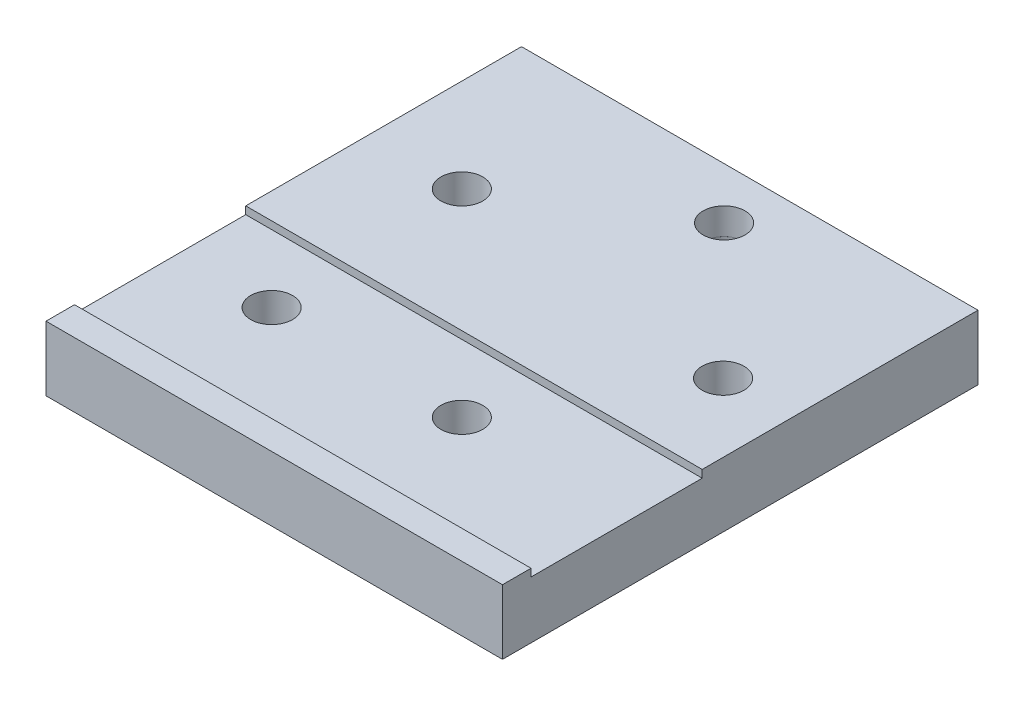
ISO-10303-21;
HEADER;
FILE_DESCRIPTION(('STEP AP214'),'2;1');
FILE_NAME('part.step','',(''),(''),'','','');
FILE_SCHEMA(('AUTOMOTIVE_DESIGN { 1 0 10303 214 1 1 1 1 }'));
ENDSEC;
DATA;
#1=APPLICATION_CONTEXT('core data for automotive mechanical design processes');
#2=APPLICATION_PROTOCOL_DEFINITION('international standard','automotive_design',2000,#1);
#3=PRODUCT_CONTEXT('',#1,'mechanical');
#4=PRODUCT('Part','Part','',(#3));
#5=PRODUCT_RELATED_PRODUCT_CATEGORY('part','',(#4));
#6=PRODUCT_DEFINITION_FORMATION('','',#4);
#7=PRODUCT_DEFINITION_CONTEXT('part definition',#1,'design');
#8=PRODUCT_DEFINITION('design','',#6,#7);
#9=PRODUCT_DEFINITION_SHAPE('','',#8);
#10=(LENGTH_UNIT() NAMED_UNIT(*) SI_UNIT(.MILLI.,.METRE.));
#11=(NAMED_UNIT(*) PLANE_ANGLE_UNIT() SI_UNIT($,.RADIAN.));
#12=(NAMED_UNIT(*) SI_UNIT($,.STERADIAN.) SOLID_ANGLE_UNIT());
#13=UNCERTAINTY_MEASURE_WITH_UNIT(LENGTH_MEASURE(1.E-05),#10,'distance_accuracy_value','');
#14=(GEOMETRIC_REPRESENTATION_CONTEXT(3) GLOBAL_UNCERTAINTY_ASSIGNED_CONTEXT((#13)) GLOBAL_UNIT_ASSIGNED_CONTEXT((#10,
#11,#12)) REPRESENTATION_CONTEXT('',''));
#15=CARTESIAN_POINT('',(0.,0.,0.));
#16=DIRECTION('',(0.,0.,1.));
#17=DIRECTION('',(1.,0.,0.));
#18=AXIS2_PLACEMENT_3D('',#15,#16,#17);
#19=CARTESIAN_POINT('',(-60.,5.,27.5));
#20=DIRECTION('',(0.,0.,-1.));
#21=DIRECTION('',(-1.,0.,0.));
#22=AXIS2_PLACEMENT_3D('',#19,#20,#21);
#23=PLANE('',#22);
#24=DIRECTION('',(1.,0.,0.));
#25=VECTOR('',#24,1.);
#26=CARTESIAN_POINT('',(-250.,7.00000000000002,27.5));
#27=LINE('',#26,#25);
#28=CARTESIAN_POINT('',(-250.,7.00000000000002,27.5));
#29=VERTEX_POINT('',#28);
#30=CARTESIAN_POINT('',(-130.,7.00000000000002,27.5));
#31=VERTEX_POINT('',#30);
#32=EDGE_CURVE('E62',#29,#31,#27,.T.);
#33=ORIENTED_EDGE('',*,*,#32,.F.);
#34=DIRECTION('',(0.,1.,0.));
#35=VECTOR('',#34,1.);
#36=CARTESIAN_POINT('',(-250.,25.,27.5));
#37=LINE('',#36,#35);
#38=CARTESIAN_POINT('',(-250.,-9.99999999999999,27.5));
#39=VERTEX_POINT('',#38);
#40=EDGE_CURVE('E116',#39,#29,#37,.T.);
#41=ORIENTED_EDGE('',*,*,#40,.F.);
#42=DIRECTION('',(-1.,0.,0.));
#43=VECTOR('',#42,1.);
#44=CARTESIAN_POINT('',(-130.,-9.99999999999999,27.5));
#45=LINE('',#44,#43);
#46=CARTESIAN_POINT('',(-130.,-9.99999999999999,27.5));
#47=VERTEX_POINT('',#46);
#48=EDGE_CURVE('E251',#47,#39,#45,.T.);
#49=ORIENTED_EDGE('',*,*,#48,.F.);
#50=DIRECTION('',(0.,-1.,0.));
#51=VECTOR('',#50,1.);
#52=CARTESIAN_POINT('',(-130.,25.,27.5));
#53=LINE('',#52,#51);
#54=EDGE_CURVE('E118',#31,#47,#53,.T.);
#55=ORIENTED_EDGE('',*,*,#54,.F.);
#56=EDGE_LOOP('',(#33,#41,#49,#55));
#57=FACE_BOUND('',#56,.T.);
#58=ADVANCED_FACE('F38',(#57),#23,.F.);
#59=CARTESIAN_POINT('',(-60.,25.,20.));
#60=DIRECTION('',(0.,0.,1.));
#61=DIRECTION('',(1.,0.,0.));
#62=AXIS2_PLACEMENT_3D('',#59,#60,#61);
#63=PLANE('',#62);
#64=DIRECTION('',(-1.,0.,0.));
#65=VECTOR('',#64,1.);
#66=CARTESIAN_POINT('',(-60.,7.00000000000002,20.));
#67=LINE('',#66,#65);
#68=CARTESIAN_POINT('',(-130.,7.00000000000002,20.));
#69=VERTEX_POINT('',#68);
#70=CARTESIAN_POINT('',(-250.,7.00000000000002,20.));
#71=VERTEX_POINT('',#70);
#72=EDGE_CURVE('E105',#69,#71,#67,.T.);
#73=ORIENTED_EDGE('',*,*,#72,.F.);
#74=DIRECTION('',(0.,1.,0.));
#75=VECTOR('',#74,1.);
#76=CARTESIAN_POINT('',(-130.,25.,20.));
#77=LINE('',#76,#75);
#78=CARTESIAN_POINT('',(-130.,5.,20.));
#79=VERTEX_POINT('',#78);
#80=EDGE_CURVE('E222',#79,#69,#77,.T.);
#81=ORIENTED_EDGE('',*,*,#80,.F.);
#82=DIRECTION('',(-1.,0.,0.));
#83=VECTOR('',#82,1.);
#84=CARTESIAN_POINT('',(-60.,5.,20.));
#85=LINE('',#84,#83);
#86=CARTESIAN_POINT('',(-250.,5.,20.));
#87=VERTEX_POINT('',#86);
#88=EDGE_CURVE('E47',#79,#87,#85,.T.);
#89=ORIENTED_EDGE('',*,*,#88,.T.);
#90=DIRECTION('',(0.,-1.,0.));
#91=VECTOR('',#90,1.);
#92=CARTESIAN_POINT('',(-250.,5.,20.));
#93=LINE('',#92,#91);
#94=EDGE_CURVE('E128',#71,#87,#93,.T.);
#95=ORIENTED_EDGE('',*,*,#94,.F.);
#96=EDGE_LOOP('',(#73,#81,#89,#95));
#97=FACE_BOUND('',#96,.T.);
#98=ADVANCED_FACE('F186',(#97),#63,.F.);
#99=CARTESIAN_POINT('',(60.,25.,-25.));
#100=DIRECTION('',(0.,0.,-1.));
#101=DIRECTION('',(-1.,0.,0.));
#102=AXIS2_PLACEMENT_3D('',#99,#100,#101);
#103=PLANE('',#102);
#104=DIRECTION('',(1.,0.,0.));
#105=VECTOR('',#104,1.);
#106=CARTESIAN_POINT('',(60.,7.00000000000002,-25.));
#107=LINE('',#106,#105);
#108=CARTESIAN_POINT('',(-250.,7.00000000000002,-25.));
#109=VERTEX_POINT('',#108);
#110=CARTESIAN_POINT('',(-130.,7.00000000000002,-25.));
#111=VERTEX_POINT('',#110);
#112=EDGE_CURVE('E55',#109,#111,#107,.T.);
#113=ORIENTED_EDGE('',*,*,#112,.F.);
#114=DIRECTION('',(0.,1.,0.));
#115=VECTOR('',#114,1.);
#116=CARTESIAN_POINT('',(-250.,25.,-25.));
#117=LINE('',#116,#115);
#118=CARTESIAN_POINT('',(-250.,5.,-25.));
#119=VERTEX_POINT('',#118);
#120=EDGE_CURVE('E143',#119,#109,#117,.T.);
#121=ORIENTED_EDGE('',*,*,#120,.F.);
#122=DIRECTION('',(1.,0.,0.));
#123=VECTOR('',#122,1.);
#124=CARTESIAN_POINT('',(60.,5.,-25.));
#125=LINE('',#124,#123);
#126=CARTESIAN_POINT('',(-130.,5.,-25.));
#127=VERTEX_POINT('',#126);
#128=EDGE_CURVE('E147',#119,#127,#125,.T.);
#129=ORIENTED_EDGE('',*,*,#128,.T.);
#130=DIRECTION('',(0.,-1.,0.));
#131=VECTOR('',#130,1.);
#132=CARTESIAN_POINT('',(-130.,25.,-25.));
#133=LINE('',#132,#131);
#134=EDGE_CURVE('E223',#111,#127,#133,.T.);
#135=ORIENTED_EDGE('',*,*,#134,.F.);
#136=EDGE_LOOP('',(#113,#121,#129,#135));
#137=FACE_BOUND('',#136,.T.);
#138=ADVANCED_FACE('F190',(#137),#103,.F.);
#139=CARTESIAN_POINT('',(0.,0.,-97.5));
#140=DIRECTION('',(0.,0.,1.));
#141=DIRECTION('',(1.,0.,0.));
#142=AXIS2_PLACEMENT_3D('',#139,#140,#141);
#143=PLANE('',#142);
#144=DIRECTION('',(-1.,0.,0.));
#145=VECTOR('',#144,1.);
#146=CARTESIAN_POINT('',(-250.,7.00000000000002,-97.5));
#147=LINE('',#146,#145);
#148=CARTESIAN_POINT('',(-130.,7.00000000000002,-97.5));
#149=VERTEX_POINT('',#148);
#150=CARTESIAN_POINT('',(-250.,7.00000000000002,-97.5));
#151=VERTEX_POINT('',#150);
#152=EDGE_CURVE('E260',#149,#151,#147,.T.);
#153=ORIENTED_EDGE('',*,*,#152,.F.);
#154=DIRECTION('',(0.,1.,0.));
#155=VECTOR('',#154,1.);
#156=CARTESIAN_POINT('',(-130.,25.,-97.5));
#157=LINE('',#156,#155);
#158=CARTESIAN_POINT('',(-130.,-9.99999999999999,-97.5));
#159=VERTEX_POINT('',#158);
#160=EDGE_CURVE('E242',#159,#149,#157,.T.);
#161=ORIENTED_EDGE('',*,*,#160,.F.);
#162=DIRECTION('',(1.,0.,0.));
#163=VECTOR('',#162,1.);
#164=CARTESIAN_POINT('',(-130.,-9.99999999999999,-97.5));
#165=LINE('',#164,#163);
#166=CARTESIAN_POINT('',(-250.,-9.99999999999999,-97.5));
#167=VERTEX_POINT('',#166);
#168=EDGE_CURVE('E236',#167,#159,#165,.T.);
#169=ORIENTED_EDGE('',*,*,#168,.F.);
#170=DIRECTION('',(0.,1.,0.));
#171=VECTOR('',#170,1.);
#172=CARTESIAN_POINT('',(-250.,25.,-97.5));
#173=LINE('',#172,#171);
#174=EDGE_CURVE('E129',#167,#151,#173,.T.);
#175=ORIENTED_EDGE('',*,*,#174,.T.);
#176=EDGE_LOOP('',(#153,#161,#169,#175));
#177=FACE_BOUND('',#176,.T.);
#178=ADVANCED_FACE('F196',(#177),#143,.F.);
#179=CARTESIAN_POINT('',(-250.,0.,0.));
#180=DIRECTION('',(1.,0.,0.));
#181=DIRECTION('',(0.,0.,-1.));
#182=AXIS2_PLACEMENT_3D('',#179,#180,#181);
#183=PLANE('',#182);
#184=DIRECTION('',(0.,0.,1.));
#185=VECTOR('',#184,1.);
#186=CARTESIAN_POINT('',(-250.,7.00000000000002,-97.5));
#187=LINE('',#186,#185);
#188=EDGE_CURVE('E110',#151,#109,#187,.T.);
#189=ORIENTED_EDGE('',*,*,#188,.F.);
#190=ORIENTED_EDGE('',*,*,#174,.F.);
#191=DIRECTION('',(0.,0.,-1.));
#192=VECTOR('',#191,1.);
#193=CARTESIAN_POINT('',(-250.,-9.99999999999999,27.5));
#194=LINE('',#193,#192);
#195=EDGE_CURVE('E126',#39,#167,#194,.T.);
#196=ORIENTED_EDGE('',*,*,#195,.F.);
#197=ORIENTED_EDGE('',*,*,#40,.T.);
#198=EDGE_CURVE('E102',#71,#29,#187,.T.);
#199=ORIENTED_EDGE('',*,*,#198,.F.);
#200=ORIENTED_EDGE('',*,*,#94,.T.);
#201=DIRECTION('',(0.,0.,-1.));
#202=VECTOR('',#201,1.);
#203=CARTESIAN_POINT('',(-250.,5.,-25.));
#204=LINE('',#203,#202);
#205=EDGE_CURVE('E133',#87,#119,#204,.T.);
#206=ORIENTED_EDGE('',*,*,#205,.T.);
#207=ORIENTED_EDGE('',*,*,#120,.T.);
#208=EDGE_LOOP('',(#189,#190,#196,#197,#199,#200,#206,#207));
#209=FACE_BOUND('',#208,.T.);
#210=ADVANCED_FACE('F124',(#209),#183,.F.);
#211=CARTESIAN_POINT('',(-130.,0.,0.));
#212=DIRECTION('',(1.,0.,0.));
#213=DIRECTION('',(0.,0.,-1.));
#214=AXIS2_PLACEMENT_3D('',#211,#212,#213);
#215=PLANE('',#214);
#216=ORIENTED_EDGE('',*,*,#160,.T.);
#217=DIRECTION('',(0.,0.,1.));
#218=VECTOR('',#217,1.);
#219=CARTESIAN_POINT('',(-130.,7.00000000000002,0.));
#220=LINE('',#219,#218);
#221=EDGE_CURVE('E11',#149,#111,#220,.T.);
#222=ORIENTED_EDGE('',*,*,#221,.T.);
#223=ORIENTED_EDGE('',*,*,#134,.T.);
#224=DIRECTION('',(0.,0.,1.));
#225=VECTOR('',#224,1.);
#226=CARTESIAN_POINT('',(-130.,5.,0.));
#227=LINE('',#226,#225);
#228=EDGE_CURVE('E217',#127,#79,#227,.T.);
#229=ORIENTED_EDGE('',*,*,#228,.T.);
#230=ORIENTED_EDGE('',*,*,#80,.T.);
#231=DIRECTION('',(0.,0.,-1.));
#232=VECTOR('',#231,1.);
#233=CARTESIAN_POINT('',(-130.,7.00000000000002,-97.5));
#234=LINE('',#233,#232);
#235=EDGE_CURVE('E120',#31,#69,#234,.T.);
#236=ORIENTED_EDGE('',*,*,#235,.F.);
#237=ORIENTED_EDGE('',*,*,#54,.T.);
#238=DIRECTION('',(0.,0.,1.));
#239=VECTOR('',#238,1.);
#240=CARTESIAN_POINT('',(-130.,-9.99999999999999,27.5));
#241=LINE('',#240,#239);
#242=EDGE_CURVE('E283',#159,#47,#241,.T.);
#243=ORIENTED_EDGE('',*,*,#242,.F.);
#244=EDGE_LOOP('',(#216,#222,#223,#229,#230,#236,#237,#243));
#245=FACE_BOUND('',#244,.T.);
#246=ADVANCED_FACE('F201',(#245),#215,.T.);
#247=CARTESIAN_POINT('',(0.,5.,0.));
#248=DIRECTION('',(0.,-1.,0.));
#249=DIRECTION('',(0.,0.,-1.));
#250=AXIS2_PLACEMENT_3D('',#247,#248,#249);
#251=PLANE('',#250);
#252=CARTESIAN_POINT('',(-225.445279058098,5.,-7.25516146171794));
#253=DIRECTION('',(0.,-1.,0.));
#254=DIRECTION('',(0.,0.,-1.));
#255=AXIS2_PLACEMENT_3D('',#252,#253,#254);
#256=CIRCLE('',#255,5.50000000000002);
#257=CARTESIAN_POINT('',(-225.445279058098,5.,-12.755161461718));
#258=VERTEX_POINT('',#257);
#259=EDGE_CURVE('E212',#258,#258,#256,.T.);
#260=ORIENTED_EDGE('',*,*,#259,.T.);
#261=EDGE_LOOP('',(#260));
#262=FACE_BOUND('',#261,.T.);
#263=CARTESIAN_POINT('',(-175.445279058098,5.,-7.25516146171793));
#264=DIRECTION('',(0.,-1.,0.));
#265=DIRECTION('',(0.,0.,-1.));
#266=AXIS2_PLACEMENT_3D('',#263,#264,#265);
#267=CIRCLE('',#266,5.50000000000002);
#268=CARTESIAN_POINT('',(-175.445279058098,5.,-12.755161461718));
#269=VERTEX_POINT('',#268);
#270=EDGE_CURVE('E136',#269,#269,#267,.T.);
#271=ORIENTED_EDGE('',*,*,#270,.T.);
#272=EDGE_LOOP('',(#271));
#273=FACE_BOUND('',#272,.T.);
#274=ORIENTED_EDGE('',*,*,#228,.F.);
#275=ORIENTED_EDGE('',*,*,#128,.F.);
#276=ORIENTED_EDGE('',*,*,#205,.F.);
#277=ORIENTED_EDGE('',*,*,#88,.F.);
#278=EDGE_LOOP('',(#274,#275,#276,#277));
#279=FACE_BOUND('',#278,.T.);
#280=ADVANCED_FACE('F180',(#262,#273,#279),#251,.F.);
#281=CARTESIAN_POINT('',(-225.445279058098,153.,-7.25516146171794));
#282=DIRECTION('',(0.,-1.,0.));
#283=DIRECTION('',(0.,0.,-1.));
#284=AXIS2_PLACEMENT_3D('',#281,#282,#283);
#285=CYLINDRICAL_SURFACE('',#284,5.50000000000002);
#286=ORIENTED_EDGE('',*,*,#259,.F.);
#287=EDGE_LOOP('',(#286));
#288=FACE_BOUND('',#287,.T.);
#289=CARTESIAN_POINT('',(-225.445279058098,-9.99999999999999,-7.25516146171794));
#290=DIRECTION('',(0.,1.,0.));
#291=DIRECTION('',(0.,0.,1.));
#292=AXIS2_PLACEMENT_3D('',#289,#290,#291);
#293=CIRCLE('',#292,5.50000000000002);
#294=CARTESIAN_POINT('',(-225.445279058098,-9.99999999999999,-1.75516146171792));
#295=VERTEX_POINT('',#294);
#296=EDGE_CURVE('E158',#295,#295,#293,.T.);
#297=ORIENTED_EDGE('',*,*,#296,.F.);
#298=EDGE_LOOP('',(#297));
#299=FACE_BOUND('',#298,.T.);
#300=ADVANCED_FACE('F171',(#288,#299),#285,.F.);
#301=CARTESIAN_POINT('',(-175.445279058098,153.,-7.25516146171793));
#302=DIRECTION('',(0.,-1.,0.));
#303=DIRECTION('',(0.,0.,-1.));
#304=AXIS2_PLACEMENT_3D('',#301,#302,#303);
#305=CYLINDRICAL_SURFACE('',#304,5.50000000000002);
#306=ORIENTED_EDGE('',*,*,#270,.F.);
#307=EDGE_LOOP('',(#306));
#308=FACE_BOUND('',#307,.T.);
#309=CARTESIAN_POINT('',(-175.445279058098,-9.99999999999999,-7.25516146171793));
#310=DIRECTION('',(0.,1.,0.));
#311=DIRECTION('',(0.,0.,1.));
#312=AXIS2_PLACEMENT_3D('',#309,#310,#311);
#313=CIRCLE('',#312,5.50000000000002);
#314=CARTESIAN_POINT('',(-175.445279058098,-9.99999999999999,-1.75516146171792));
#315=VERTEX_POINT('',#314);
#316=EDGE_CURVE('E41',#315,#315,#313,.T.);
#317=ORIENTED_EDGE('',*,*,#316,.F.);
#318=EDGE_LOOP('',(#317));
#319=FACE_BOUND('',#318,.T.);
#320=ADVANCED_FACE('F169',(#308,#319),#305,.F.);
#321=CARTESIAN_POINT('',(0.,-9.99999999999999,0.));
#322=DIRECTION('',(0.,1.,0.));
#323=DIRECTION('',(0.,0.,1.));
#324=AXIS2_PLACEMENT_3D('',#321,#322,#323);
#325=PLANE('',#324);
#326=ORIENTED_EDGE('',*,*,#316,.T.);
#327=EDGE_LOOP('',(#326));
#328=FACE_BOUND('',#327,.T.);
#329=ORIENTED_EDGE('',*,*,#296,.T.);
#330=EDGE_LOOP('',(#329));
#331=FACE_BOUND('',#330,.T.);
#332=CARTESIAN_POINT('',(-183.240850763284,-9.99999999999999,-83.9875418560589));
#333=DIRECTION('',(0.,1.,0.));
#334=DIRECTION('',(0.,0.,1.));
#335=AXIS2_PLACEMENT_3D('',#332,#333,#334);
#336=CIRCLE('',#335,5.48393848664935);
#337=CARTESIAN_POINT('',(-183.240850763284,-9.99999999999999,-78.5036033694095));
#338=VERTEX_POINT('',#337);
#339=EDGE_CURVE('E157',#338,#338,#336,.T.);
#340=ORIENTED_EDGE('',*,*,#339,.T.);
#341=EDGE_LOOP('',(#340));
#342=FACE_BOUND('',#341,.T.);
#343=CARTESIAN_POINT('',(-225.445279058098,-9.99999999999999,-57.2551614617179));
#344=DIRECTION('',(0.,1.,0.));
#345=DIRECTION('',(0.,0.,1.));
#346=AXIS2_PLACEMENT_3D('',#343,#344,#345);
#347=CIRCLE('',#346,5.50000000000002);
#348=CARTESIAN_POINT('',(-225.445279058098,-9.99999999999999,-51.7551614617179));
#349=VERTEX_POINT('',#348);
#350=EDGE_CURVE('E318',#349,#349,#347,.T.);
#351=ORIENTED_EDGE('',*,*,#350,.T.);
#352=EDGE_LOOP('',(#351));
#353=FACE_BOUND('',#352,.T.);
#354=CARTESIAN_POINT('',(-148.018210700188,-9.99999999999999,-48.5));
#355=DIRECTION('',(0.,1.,0.));
#356=DIRECTION('',(0.,0.,1.));
#357=AXIS2_PLACEMENT_3D('',#354,#355,#356);
#358=CIRCLE('',#357,5.50000000000002);
#359=CARTESIAN_POINT('',(-148.018210700188,-9.99999999999999,-43.));
#360=VERTEX_POINT('',#359);
#361=EDGE_CURVE('E111',#360,#360,#358,.T.);
#362=ORIENTED_EDGE('',*,*,#361,.T.);
#363=EDGE_LOOP('',(#362));
#364=FACE_BOUND('',#363,.T.);
#365=ORIENTED_EDGE('',*,*,#242,.T.);
#366=ORIENTED_EDGE('',*,*,#48,.T.);
#367=ORIENTED_EDGE('',*,*,#195,.T.);
#368=ORIENTED_EDGE('',*,*,#168,.T.);
#369=EDGE_LOOP('',(#365,#366,#367,#368));
#370=FACE_BOUND('',#369,.T.);
#371=ADVANCED_FACE('F167',(#328,#331,#342,#353,#364,#370),#325,.F.);
#372=CARTESIAN_POINT('',(0.,7.00000000000002,0.));
#373=DIRECTION('',(0.,1.,0.));
#374=DIRECTION('',(0.,0.,1.));
#375=AXIS2_PLACEMENT_3D('',#372,#373,#374);
#376=PLANE('',#375);
#377=ORIENTED_EDGE('',*,*,#72,.T.);
#378=ORIENTED_EDGE('',*,*,#198,.T.);
#379=ORIENTED_EDGE('',*,*,#32,.T.);
#380=ORIENTED_EDGE('',*,*,#235,.T.);
#381=EDGE_LOOP('',(#377,#378,#379,#380));
#382=FACE_BOUND('',#381,.T.);
#383=ADVANCED_FACE('F103',(#382),#376,.T.);
#384=CARTESIAN_POINT('',(-183.240850763284,7.00000000000003,-83.9875418560589));
#385=DIRECTION('',(0.,1.,0.));
#386=DIRECTION('',(0.,0.,1.));
#387=AXIS2_PLACEMENT_3D('',#384,#385,#386);
#388=CIRCLE('',#387,5.50000000000002);
#389=CARTESIAN_POINT('',(-183.240850763284,7.00000000000003,-78.4875418560588));
#390=VERTEX_POINT('',#389);
#391=EDGE_CURVE('E275',#390,#390,#388,.F.);
#392=ORIENTED_EDGE('',*,*,#391,.T.);
#393=EDGE_LOOP('',(#392));
#394=FACE_BOUND('',#393,.T.);
#395=CARTESIAN_POINT('',(-148.018210700188,7.00000000000003,-48.5));
#396=DIRECTION('',(0.,1.,0.));
#397=DIRECTION('',(0.,0.,1.));
#398=AXIS2_PLACEMENT_3D('',#395,#396,#397);
#399=CIRCLE('',#398,5.50000000000002);
#400=CARTESIAN_POINT('',(-148.018210700188,7.00000000000003,-43.));
#401=VERTEX_POINT('',#400);
#402=EDGE_CURVE('E268',#401,#401,#399,.F.);
#403=ORIENTED_EDGE('',*,*,#402,.T.);
#404=EDGE_LOOP('',(#403));
#405=FACE_BOUND('',#404,.T.);
#406=CARTESIAN_POINT('',(-225.445279058098,7.00000000000003,-57.2551614617179));
#407=DIRECTION('',(0.,1.,0.));
#408=DIRECTION('',(0.,0.,1.));
#409=AXIS2_PLACEMENT_3D('',#406,#407,#408);
#410=CIRCLE('',#409,5.50000000000002);
#411=CARTESIAN_POINT('',(-225.445279058098,7.00000000000003,-51.7551614617179));
#412=VERTEX_POINT('',#411);
#413=EDGE_CURVE('E263',#412,#412,#410,.F.);
#414=ORIENTED_EDGE('',*,*,#413,.T.);
#415=EDGE_LOOP('',(#414));
#416=FACE_BOUND('',#415,.T.);
#417=ORIENTED_EDGE('',*,*,#112,.T.);
#418=ORIENTED_EDGE('',*,*,#221,.F.);
#419=ORIENTED_EDGE('',*,*,#152,.T.);
#420=ORIENTED_EDGE('',*,*,#188,.T.);
#421=EDGE_LOOP('',(#417,#418,#419,#420));
#422=FACE_BOUND('',#421,.T.);
#423=ADVANCED_FACE('F259',(#394,#405,#416,#422),#376,.T.);
#424=CARTESIAN_POINT('',(-225.445279058098,153.,-57.2551614617179));
#425=DIRECTION('',(0.,-1.,0.));
#426=DIRECTION('',(0.,0.,-1.));
#427=AXIS2_PLACEMENT_3D('',#424,#425,#426);
#428=CYLINDRICAL_SURFACE('',#427,5.50000000000002);
#429=ORIENTED_EDGE('',*,*,#413,.F.);
#430=EDGE_LOOP('',(#429));
#431=FACE_BOUND('',#430,.T.);
#432=ORIENTED_EDGE('',*,*,#350,.F.);
#433=EDGE_LOOP('',(#432));
#434=FACE_BOUND('',#433,.T.);
#435=ADVANCED_FACE('F307',(#431,#434),#428,.F.);
#436=CARTESIAN_POINT('',(-148.018210700188,153.,-48.5));
#437=DIRECTION('',(0.,-1.,0.));
#438=DIRECTION('',(0.,0.,-1.));
#439=AXIS2_PLACEMENT_3D('',#436,#437,#438);
#440=CYLINDRICAL_SURFACE('',#439,5.50000000000002);
#441=ORIENTED_EDGE('',*,*,#402,.F.);
#442=EDGE_LOOP('',(#441));
#443=FACE_BOUND('',#442,.T.);
#444=ORIENTED_EDGE('',*,*,#361,.F.);
#445=EDGE_LOOP('',(#444));
#446=FACE_BOUND('',#445,.T.);
#447=ADVANCED_FACE('F303',(#443,#446),#440,.F.);
#448=CARTESIAN_POINT('',(0.,0.,0.));
#449=DIRECTION('',(0.,1.,0.));
#450=DIRECTION('',(0.,0.,1.));
#451=AXIS2_PLACEMENT_3D('',#448,#449,#450);
#452=PLANE('',#451);
#453=CARTESIAN_POINT('',(-183.240850763284,0.,-83.9875418560589));
#454=DIRECTION('',(0.,1.,0.));
#455=DIRECTION('',(0.,0.,1.));
#456=AXIS2_PLACEMENT_3D('',#453,#454,#455);
#457=CIRCLE('',#456,5.48393848664935);
#458=CARTESIAN_POINT('',(-183.240850763284,0.,-78.5036033694095));
#459=VERTEX_POINT('',#458);
#460=EDGE_CURVE('E154',#459,#459,#457,.T.);
#461=ORIENTED_EDGE('',*,*,#460,.F.);
#462=EDGE_LOOP('',(#461));
#463=FACE_BOUND('',#462,.T.);
#464=CARTESIAN_POINT('',(-183.240850763284,0.,-83.9875418560589));
#465=DIRECTION('',(0.,-1.,0.));
#466=DIRECTION('',(0.,0.,-1.));
#467=AXIS2_PLACEMENT_3D('',#464,#465,#466);
#468=CIRCLE('',#467,5.50000000000002);
#469=CARTESIAN_POINT('',(-183.240850763284,0.,-89.4875418560589));
#470=VERTEX_POINT('',#469);
#471=EDGE_CURVE('E233',#470,#470,#468,.T.);
#472=ORIENTED_EDGE('',*,*,#471,.F.);
#473=EDGE_LOOP('',(#472));
#474=FACE_BOUND('',#473,.T.);
#475=ADVANCED_FACE('F293',(#463,#474),#452,.T.);
#476=CARTESIAN_POINT('',(-183.240850763284,153.,-83.9875418560589));
#477=DIRECTION('',(0.,-1.,0.));
#478=DIRECTION('',(0.,0.,-1.));
#479=AXIS2_PLACEMENT_3D('',#476,#477,#478);
#480=CYLINDRICAL_SURFACE('',#479,5.50000000000002);
#481=ORIENTED_EDGE('',*,*,#471,.T.);
#482=EDGE_LOOP('',(#481));
#483=FACE_BOUND('',#482,.T.);
#484=ORIENTED_EDGE('',*,*,#391,.F.);
#485=EDGE_LOOP('',(#484));
#486=FACE_BOUND('',#485,.T.);
#487=ADVANCED_FACE('F290',(#483,#486),#480,.F.);
#488=CARTESIAN_POINT('',(-183.240850763284,-40.,-83.9875418560589));
#489=DIRECTION('',(0.,1.,0.));
#490=DIRECTION('',(0.,0.,1.));
#491=AXIS2_PLACEMENT_3D('',#488,#489,#490);
#492=CYLINDRICAL_SURFACE('',#491,5.48393848664935);
#493=CARTESIAN_POINT('',(-183.240850763284,0.,-78.5036033694095));
#494=CARTESIAN_POINT('',(-183.240850763284,-0.104166666666667,-78.5036033694095));
#495=CARTESIAN_POINT('',(-183.240850763284,-0.208333333333334,-78.5036033694095));
#496=CARTESIAN_POINT('',(-183.240850763284,-0.416666666666667,-78.5036033694095));
#497=CARTESIAN_POINT('',(-183.240850763284,-0.520833333333334,-78.5036033694095));
#498=CARTESIAN_POINT('',(-183.240850763284,-0.729166666666667,-78.5036033694095));
#499=CARTESIAN_POINT('',(-183.240850763284,-0.833333333333334,-78.5036033694095));
#500=CARTESIAN_POINT('',(-183.240850763284,-1.04166666666667,-78.5036033694095));
#501=CARTESIAN_POINT('',(-183.240850763284,-1.14583333333333,-78.5036033694095));
#502=CARTESIAN_POINT('',(-183.240850763284,-1.35416666666667,-78.5036033694095));
#503=CARTESIAN_POINT('',(-183.240850763284,-1.45833333333333,-78.5036033694095));
#504=CARTESIAN_POINT('',(-183.240850763284,-1.66666666666667,-78.5036033694095));
#505=CARTESIAN_POINT('',(-183.240850763284,-1.77083333333334,-78.5036033694095));
#506=CARTESIAN_POINT('',(-183.240850763284,-1.97916666666667,-78.5036033694095));
#507=CARTESIAN_POINT('',(-183.240850763284,-2.08333333333334,-78.5036033694095));
#508=CARTESIAN_POINT('',(-183.240850763284,-2.29166666666667,-78.5036033694095));
#509=CARTESIAN_POINT('',(-183.240850763284,-2.39583333333334,-78.5036033694095));
#510=CARTESIAN_POINT('',(-183.240850763284,-2.60416666666667,-78.5036033694095));
#511=CARTESIAN_POINT('',(-183.240850763284,-2.70833333333333,-78.5036033694095));
#512=CARTESIAN_POINT('',(-183.240850763284,-2.91666666666666,-78.5036033694095));
#513=CARTESIAN_POINT('',(-183.240850763284,-3.02083333333333,-78.5036033694095));
#514=CARTESIAN_POINT('',(-183.240850763284,-3.22916666666666,-78.5036033694095));
#515=CARTESIAN_POINT('',(-183.240850763284,-3.33333333333333,-78.5036033694095));
#516=CARTESIAN_POINT('',(-183.240850763284,-3.54166666666666,-78.5036033694095));
#517=CARTESIAN_POINT('',(-183.240850763284,-3.64583333333333,-78.5036033694095));
#518=CARTESIAN_POINT('',(-183.240850763284,-3.85416666666666,-78.5036033694095));
#519=CARTESIAN_POINT('',(-183.240850763284,-3.95833333333333,-78.5036033694095));
#520=CARTESIAN_POINT('',(-183.240850763284,-4.16666666666666,-78.5036033694095));
#521=CARTESIAN_POINT('',(-183.240850763284,-4.27083333333333,-78.5036033694095));
#522=CARTESIAN_POINT('',(-183.240850763284,-4.47916666666666,-78.5036033694095));
#523=CARTESIAN_POINT('',(-183.240850763284,-4.58333333333333,-78.5036033694095));
#524=CARTESIAN_POINT('',(-183.240850763284,-4.79166666666666,-78.5036033694095));
#525=CARTESIAN_POINT('',(-183.240850763284,-4.89583333333333,-78.5036033694095));
#526=CARTESIAN_POINT('',(-183.240850763284,-5.10416666666666,-78.5036033694095));
#527=CARTESIAN_POINT('',(-183.240850763284,-5.20833333333333,-78.5036033694095));
#528=CARTESIAN_POINT('',(-183.240850763284,-5.41666666666666,-78.5036033694095));
#529=CARTESIAN_POINT('',(-183.240850763284,-5.52083333333333,-78.5036033694095));
#530=CARTESIAN_POINT('',(-183.240850763284,-5.72916666666666,-78.5036033694095));
#531=CARTESIAN_POINT('',(-183.240850763284,-5.83333333333333,-78.5036033694095));
#532=CARTESIAN_POINT('',(-183.240850763284,-6.04166666666667,-78.5036033694095));
#533=CARTESIAN_POINT('',(-183.240850763284,-6.14583333333333,-78.5036033694095));
#534=CARTESIAN_POINT('',(-183.240850763284,-6.35416666666667,-78.5036033694095));
#535=CARTESIAN_POINT('',(-183.240850763284,-6.45833333333333,-78.5036033694095));
#536=CARTESIAN_POINT('',(-183.240850763284,-6.66666666666667,-78.5036033694095));
#537=CARTESIAN_POINT('',(-183.240850763284,-6.77083333333333,-78.5036033694095));
#538=CARTESIAN_POINT('',(-183.240850763284,-6.97916666666667,-78.5036033694095));
#539=CARTESIAN_POINT('',(-183.240850763284,-7.08333333333333,-78.5036033694095));
#540=CARTESIAN_POINT('',(-183.240850763284,-7.29166666666666,-78.5036033694095));
#541=CARTESIAN_POINT('',(-183.240850763284,-7.39583333333333,-78.5036033694095));
#542=CARTESIAN_POINT('',(-183.240850763284,-7.60416666666666,-78.5036033694095));
#543=CARTESIAN_POINT('',(-183.240850763284,-7.70833333333333,-78.5036033694095));
#544=CARTESIAN_POINT('',(-183.240850763284,-7.91666666666666,-78.5036033694095));
#545=CARTESIAN_POINT('',(-183.240850763284,-8.02083333333333,-78.5036033694095));
#546=CARTESIAN_POINT('',(-183.240850763284,-8.22916666666666,-78.5036033694095));
#547=CARTESIAN_POINT('',(-183.240850763284,-8.33333333333333,-78.5036033694095));
#548=CARTESIAN_POINT('',(-183.240850763284,-8.54166666666666,-78.5036033694095));
#549=CARTESIAN_POINT('',(-183.240850763284,-8.64583333333333,-78.5036033694095));
#550=CARTESIAN_POINT('',(-183.240850763284,-8.85416666666666,-78.5036033694095));
#551=CARTESIAN_POINT('',(-183.240850763284,-8.95833333333333,-78.5036033694095));
#552=CARTESIAN_POINT('',(-183.240850763284,-9.16666666666666,-78.5036033694095));
#553=CARTESIAN_POINT('',(-183.240850763284,-9.27083333333332,-78.5036033694095));
#554=CARTESIAN_POINT('',(-183.240850763284,-9.47916666666666,-78.5036033694095));
#555=CARTESIAN_POINT('',(-183.240850763284,-9.58333333333332,-78.5036033694095));
#556=CARTESIAN_POINT('',(-183.240850763284,-9.79166666666666,-78.5036033694095));
#557=CARTESIAN_POINT('',(-183.240850763284,-9.89583333333333,-78.5036033694095));
#558=CARTESIAN_POINT('',(-183.240850763284,-9.99999999999999,-78.5036033694095));
#559=B_SPLINE_CURVE_WITH_KNOTS('',3,(#493,#494,#495,#496,#497,#498,#499,#500,#501,#502,#503,
#504,#505,#506,#507,#508,#509,#510,#511,#512,#513,#514,#515,#516,#517,#518,#519,#520,#521,#522,
#523,#524,#525,#526,#527,#528,#529,#530,#531,#532,#533,#534,#535,#536,#537,#538,#539,#540,#541,
#542,#543,#544,#545,#546,#547,#548,#549,#550,#551,#552,#553,#554,#555,#556,#557,#558),
.UNSPECIFIED.,.F.,.F.,(4,2,2,2,2,2,2,2,2,2,2,2,2,2,2,2,2,2,2,2,2,2,2,2,2,2,2,2,2,2,2,2,4),(0.,
0.3125,0.625000000000001,0.937500000000001,1.25,1.5625,1.875,2.1875,2.5,2.8125,3.125,3.4375,
3.75,4.0625,4.375,4.6875,5.,5.3125,5.625,5.9375,6.25,6.5625,6.875,7.1875,7.49999999999999,
7.8125,8.12499999999999,8.43749999999999,8.74999999999999,9.06249999999999,9.37499999999999,
9.68749999999999,9.99999999999999),.UNSPECIFIED.);
#560=EDGE_CURVE('BSEAM292',#459,#338,#559,.T.);
#561=ORIENTED_EDGE('',*,*,#460,.T.);
#562=ORIENTED_EDGE('',*,*,#339,.F.);
#563=ORIENTED_EDGE('',*,*,#560,.T.);
#564=ORIENTED_EDGE('',*,*,#560,.F.);
#565=EDGE_LOOP('',(#561,#563,#562,#564));
#566=FACE_BOUND('',#565,.T.);
#567=ADVANCED_FACE('F292',(#566),#492,.F.);
#568=CLOSED_SHELL('',(#58,#98,#138,#178,#210,#246,#280,#300,#320,#371,#383,#423,#435,#447,#475,
#487,#567));
#569=MANIFOLD_SOLID_BREP('B2',#568);
#570=ADVANCED_BREP_SHAPE_REPRESENTATION('',(#18,#569),#14);
#571=SHAPE_DEFINITION_REPRESENTATION(#9,#570);
ENDSEC;
END-ISO-10303-21;
